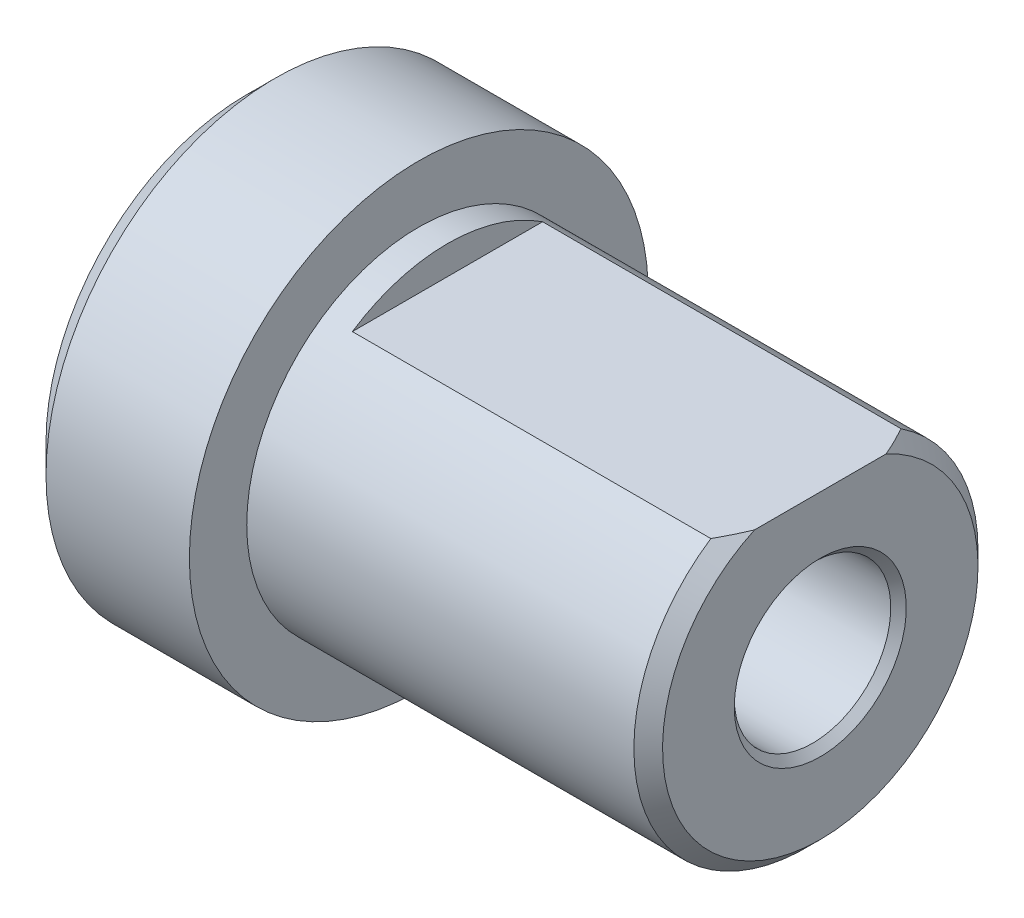
ISO-10303-21;
HEADER;
FILE_DESCRIPTION(('STEP AP214'),'2;1');
FILE_NAME('part.step','',(''),(''),'','','');
FILE_SCHEMA(('AUTOMOTIVE_DESIGN { 1 0 10303 214 1 1 1 1 }'));
ENDSEC;
DATA;
#1=APPLICATION_CONTEXT('core data for automotive mechanical design processes');
#2=APPLICATION_PROTOCOL_DEFINITION('international standard','automotive_design',2000,#1);
#3=PRODUCT_CONTEXT('',#1,'mechanical');
#4=PRODUCT('Part','Part','',(#3));
#5=PRODUCT_RELATED_PRODUCT_CATEGORY('part','',(#4));
#6=PRODUCT_DEFINITION_FORMATION('','',#4);
#7=PRODUCT_DEFINITION_CONTEXT('part definition',#1,'design');
#8=PRODUCT_DEFINITION('design','',#6,#7);
#9=PRODUCT_DEFINITION_SHAPE('','',#8);
#10=(LENGTH_UNIT() NAMED_UNIT(*) SI_UNIT(.MILLI.,.METRE.));
#11=(NAMED_UNIT(*) PLANE_ANGLE_UNIT() SI_UNIT($,.RADIAN.));
#12=(NAMED_UNIT(*) SI_UNIT($,.STERADIAN.) SOLID_ANGLE_UNIT());
#13=UNCERTAINTY_MEASURE_WITH_UNIT(LENGTH_MEASURE(1.E-05),#10,'distance_accuracy_value','');
#14=(GEOMETRIC_REPRESENTATION_CONTEXT(3) GLOBAL_UNCERTAINTY_ASSIGNED_CONTEXT((#13)) GLOBAL_UNIT_ASSIGNED_CONTEXT((#10,
#11,#12)) REPRESENTATION_CONTEXT('',''));
#15=CARTESIAN_POINT('',(0.,0.,0.));
#16=DIRECTION('',(0.,0.,1.));
#17=DIRECTION('',(1.,0.,0.));
#18=AXIS2_PLACEMENT_3D('',#15,#16,#17);
#19=CARTESIAN_POINT('',(0.,1.5,0.));
#20=DIRECTION('',(-1.,0.,0.));
#21=DIRECTION('',(0.,0.,1.));
#22=AXIS2_PLACEMENT_3D('',#19,#20,#21);
#23=PLANE('',#22);
#24=CARTESIAN_POINT('',(0.,0.,0.));
#25=DIRECTION('',(-1.,0.,0.));
#26=DIRECTION('',(0.,0.,1.));
#27=AXIS2_PLACEMENT_3D('',#24,#25,#26);
#28=CIRCLE('',#27,1.5);
#29=CARTESIAN_POINT('',(0.,0.,1.5));
#30=VERTEX_POINT('',#29);
#31=EDGE_CURVE('E101',#30,#30,#28,.T.);
#32=ORIENTED_EDGE('',*,*,#31,.T.);
#33=EDGE_LOOP('',(#32));
#34=FACE_BOUND('',#33,.T.);
#35=CARTESIAN_POINT('',(0.,0.,0.));
#36=DIRECTION('',(-1.,0.,0.));
#37=DIRECTION('',(0.,0.,1.));
#38=AXIS2_PLACEMENT_3D('',#35,#36,#37);
#39=CIRCLE('',#38,2.75);
#40=CARTESIAN_POINT('',(0.,2.5,-1.14564392373896));
#41=VERTEX_POINT('',#40);
#42=CARTESIAN_POINT('',(0.,2.5,1.14564392373896));
#43=VERTEX_POINT('',#42);
#44=EDGE_CURVE('E76',#41,#43,#39,.T.);
#45=ORIENTED_EDGE('',*,*,#44,.F.);
#46=DIRECTION('',(0.,0.,-1.));
#47=VECTOR('',#46,1.);
#48=CARTESIAN_POINT('',(0.,2.5,4.));
#49=LINE('',#48,#47);
#50=EDGE_CURVE('E83',#43,#41,#49,.T.);
#51=ORIENTED_EDGE('',*,*,#50,.F.);
#52=EDGE_LOOP('',(#45,#51));
#53=FACE_BOUND('',#52,.T.);
#54=ADVANCED_FACE('F37',(#34,#53),#23,.F.);
#55=CARTESIAN_POINT('',(0.,0.,0.));
#56=DIRECTION('',(-1.,0.,0.));
#57=DIRECTION('',(0.,0.,1.));
#58=AXIS2_PLACEMENT_3D('',#55,#56,#57);
#59=CYLINDRICAL_SURFACE('',#58,3.);
#60=CARTESIAN_POINT('',(-7.,0.,0.));
#61=DIRECTION('',(-1.,0.,0.));
#62=DIRECTION('',(0.,0.,1.));
#63=AXIS2_PLACEMENT_3D('',#60,#61,#62);
#64=CIRCLE('',#63,3.);
#65=CARTESIAN_POINT('',(-7.,0.,3.));
#66=VERTEX_POINT('',#65);
#67=EDGE_CURVE('E98',#66,#66,#64,.T.);
#68=ORIENTED_EDGE('',*,*,#67,.F.);
#69=EDGE_LOOP('',(#68));
#70=FACE_BOUND('',#69,.T.);
#71=CARTESIAN_POINT('',(-0.25,0.,0.));
#72=DIRECTION('',(-1.,0.,0.));
#73=DIRECTION('',(0.,0.,1.));
#74=AXIS2_PLACEMENT_3D('',#71,#72,#73);
#75=CIRCLE('',#74,3.);
#76=CARTESIAN_POINT('',(-0.25,2.5,-1.6583123951777));
#77=VERTEX_POINT('',#76);
#78=CARTESIAN_POINT('',(-0.25,2.5,1.6583123951777));
#79=VERTEX_POINT('',#78);
#80=EDGE_CURVE('E57',#77,#79,#75,.T.);
#81=ORIENTED_EDGE('',*,*,#80,.T.);
#82=DIRECTION('',(-1.,0.,0.));
#83=VECTOR('',#82,1.);
#84=CARTESIAN_POINT('',(0.,2.5,1.6583123951777));
#85=LINE('',#84,#83);
#86=CARTESIAN_POINT('',(-6.5,2.5,1.6583123951777));
#87=VERTEX_POINT('',#86);
#88=EDGE_CURVE('E85',#87,#79,#85,.F.);
#89=ORIENTED_EDGE('',*,*,#88,.F.);
#90=CARTESIAN_POINT('',(-6.5,0.,0.));
#91=DIRECTION('',(1.,0.,0.));
#92=DIRECTION('',(0.,0.,-1.));
#93=AXIS2_PLACEMENT_3D('',#90,#91,#92);
#94=CIRCLE('',#93,3.);
#95=CARTESIAN_POINT('',(-6.5,2.5,-1.6583123951777));
#96=VERTEX_POINT('',#95);
#97=EDGE_CURVE('E114',#96,#87,#94,.T.);
#98=ORIENTED_EDGE('',*,*,#97,.F.);
#99=DIRECTION('',(-1.,0.,0.));
#100=VECTOR('',#99,1.);
#101=CARTESIAN_POINT('',(0.,2.5,-1.6583123951777));
#102=LINE('',#101,#100);
#103=EDGE_CURVE('E115',#77,#96,#102,.T.);
#104=ORIENTED_EDGE('',*,*,#103,.F.);
#105=EDGE_LOOP('',(#81,#89,#98,#104));
#106=FACE_BOUND('',#105,.T.);
#107=ADVANCED_FACE('F119',(#70,#106),#59,.T.);
#108=CARTESIAN_POINT('',(0.,2.5,0.));
#109=DIRECTION('',(0.,1.,0.));
#110=DIRECTION('',(0.,0.,1.));
#111=AXIS2_PLACEMENT_3D('',#108,#109,#110);
#112=PLANE('',#111);
#113=ORIENTED_EDGE('',*,*,#88,.T.);
#114=CARTESIAN_POINT('',(-1.67749195989252,2.5,3.65413259952521));
#115=CARTESIAN_POINT('',(-1.62395797741389,2.5,3.58926544106276));
#116=CARTESIAN_POINT('',(-1.57069094200197,2.5,3.524178215062));
#117=CARTESIAN_POINT('',(-1.46477799794177,2.5,3.39349697429184));
#118=CARTESIAN_POINT('',(-1.41213211006432,2.5,3.32790294269585));
#119=CARTESIAN_POINT('',(-1.25513407873059,2.5,3.13010554410299));
#120=CARTESIAN_POINT('',(-1.15185334275176,2.5,2.99704569542344));
#121=CARTESIAN_POINT('',(-0.946885856877835,2.5,2.72491566850451));
#122=CARTESIAN_POINT('',(-0.845288829592145,2.5,2.58577762209185));
#123=CARTESIAN_POINT('',(-0.647912105180442,2.5,2.30348196113854));
#124=CARTESIAN_POINT('',(-0.552129513625497,2.5,2.16032639928944));
#125=CARTESIAN_POINT('',(-0.401757387795607,2.5,1.92064577038633));
#126=CARTESIAN_POINT('',(-0.344660397222246,2.5,1.82570039234345));
#127=CARTESIAN_POINT('',(-0.235123218787926,2.5,1.63316774847458));
#128=CARTESIAN_POINT('',(-0.18268176642285,2.5,1.53558120947657));
#129=CARTESIAN_POINT('',(-0.0841516374493152,2.5,1.33780837117945));
#130=CARTESIAN_POINT('',(-0.0380334796287256,2.5,1.23763691785783));
#131=CARTESIAN_POINT('',(0.0462014787861243,2.5,1.03397456861831));
#132=CARTESIAN_POINT('',(0.0843227670678341,2.5,0.93048557223631));
#133=CARTESIAN_POINT('',(0.140017114636043,2.5,0.752829484772054));
#134=CARTESIAN_POINT('',(0.160297058056315,2.5,0.679513500497337));
#135=CARTESIAN_POINT('',(0.195127462600921,2.5,0.531542595451983));
#136=CARTESIAN_POINT('',(0.209680225768848,2.5,0.456888225288227));
#137=CARTESIAN_POINT('',(0.232333990979544,2.5,0.306800353992969));
#138=CARTESIAN_POINT('',(0.240452398034348,2.5,0.231369517706711));
#139=CARTESIAN_POINT('',(0.249856995627712,2.5,0.0800786665543288));
#140=CARTESIAN_POINT('',(0.251143441921742,2.5,0.00421866786039122));
#141=CARTESIAN_POINT('',(0.246807578747195,2.5,-0.147375922436032));
#142=CARTESIAN_POINT('',(0.241178399810755,2.5,-0.223110314395744));
#143=CARTESIAN_POINT('',(0.223318628808779,2.5,-0.373790159303397));
#144=CARTESIAN_POINT('',(0.211087461897093,2.5,-0.448735542971649));
#145=CARTESIAN_POINT('',(0.180595804372142,2.5,-0.597639128662982));
#146=CARTESIAN_POINT('',(0.162314987243843,2.5,-0.671593115900845));
#147=CARTESIAN_POINT('',(0.120517881314084,2.5,-0.817981614725862));
#148=CARTESIAN_POINT('',(0.0970015494285237,2.5,-0.890416113803476));
#149=CARTESIAN_POINT('',(0.0105937929552411,2.5,-1.13106070421559));
#150=CARTESIAN_POINT('',(-0.062381323139259,2.5,-1.29567172889325));
#151=CARTESIAN_POINT('',(-0.183607500129111,2.5,-1.53650568367434));
#152=CARTESIAN_POINT('',(-0.226036792499501,2.5,-1.61586458426326));
#153=CARTESIAN_POINT('',(-0.314082796919921,2.5,-1.77279955607548));
#154=CARTESIAN_POINT('',(-0.359699051429776,2.5,-1.8503758811));
#155=CARTESIAN_POINT('',(-0.50095236624636,2.5,-2.08176845700008));
#156=CARTESIAN_POINT('',(-0.600452506830223,2.5,-2.2332131319978));
#157=CARTESIAN_POINT('',(-0.806078378820841,2.5,-2.53125630459559));
#158=CARTESIAN_POINT('',(-0.912198114424832,2.5,-2.67785900893076));
#159=CARTESIAN_POINT('',(-1.12708837042466,2.5,-2.96491018555446));
#160=CARTESIAN_POINT('',(-1.23577435936566,2.5,-3.10542224200297));
#161=CARTESIAN_POINT('',(-1.4005887507484,2.5,-3.31347804417295));
#162=CARTESIAN_POINT('',(-1.4555032678476,2.5,-3.38199111675543));
#163=CARTESIAN_POINT('',(-1.56601230637735,2.5,-3.51846014985454));
#164=CARTESIAN_POINT('',(-1.62160678709349,2.5,-3.58641614332456));
#165=CARTESIAN_POINT('',(-1.67749195989252,2.5,-3.65413259952521));
#166=B_SPLINE_CURVE_WITH_KNOTS('',3,(#114,#115,#116,#117,#118,#119,#120,#121,#122,#123,#124,
#125,#126,#127,#128,#129,#130,#131,#132,#133,#134,#135,#136,#137,#138,#139,#140,#141,#142,#143,
#144,#145,#146,#147,#148,#149,#150,#151,#152,#153,#154,#155,#156,#157,#158,#159,#160,#161,#162,
#163,#164,#165),.UNSPECIFIED.,.F.,.F.,(4,2,2,2,2,2,2,2,2,2,2,2,2,2,2,2,2,2,2,2,2,2,2,2,2,4),(0.,
0.25231307319132,0.504634559814167,1.00989653913261,1.52665364516633,2.04315136335998,
2.37542919710035,2.70761650199845,3.03819816560234,3.36859381397354,3.59660850520671,
3.82453145195833,4.05183573983055,4.27913151847287,4.50665325850679,4.73419481243615,
4.96250879102862,5.19082464853207,5.72937702800235,5.99932397808088,6.26923225221504,
6.81254493708658,7.35537245939352,7.88822611015625,8.15163686516664,8.41503192431477),.UNSPECIFIED.);
#167=EDGE_CURVE('E11',#79,#43,#166,.T.);
#168=ORIENTED_EDGE('',*,*,#167,.T.);
#169=ORIENTED_EDGE('',*,*,#50,.T.);
#170=EDGE_CURVE('E41',#41,#77,#166,.T.);
#171=ORIENTED_EDGE('',*,*,#170,.T.);
#172=ORIENTED_EDGE('',*,*,#103,.T.);
#173=DIRECTION('',(0.,0.,1.));
#174=VECTOR('',#173,1.);
#175=CARTESIAN_POINT('',(-6.5,2.5,-4.));
#176=LINE('',#175,#174);
#177=EDGE_CURVE('E65',#96,#87,#176,.T.);
#178=ORIENTED_EDGE('',*,*,#177,.T.);
#179=EDGE_LOOP('',(#113,#168,#169,#171,#172,#178));
#180=FACE_BOUND('',#179,.T.);
#181=ADVANCED_FACE('F82',(#180),#112,.T.);
#182=CARTESIAN_POINT('',(-10.,3.5,0.));
#183=DIRECTION('',(1.,0.,0.));
#184=DIRECTION('',(0.,0.,-1.));
#185=AXIS2_PLACEMENT_3D('',#182,#183,#184);
#186=PLANE('',#185);
#187=CARTESIAN_POINT('',(-10.,0.,0.));
#188=DIRECTION('',(-1.,0.,0.));
#189=DIRECTION('',(0.,0.,1.));
#190=AXIS2_PLACEMENT_3D('',#187,#188,#189);
#191=CIRCLE('',#190,1.5);
#192=CARTESIAN_POINT('',(-10.,0.,1.5));
#193=VERTEX_POINT('',#192);
#194=EDGE_CURVE('E110',#193,#193,#191,.T.);
#195=ORIENTED_EDGE('',*,*,#194,.F.);
#196=EDGE_LOOP('',(#195));
#197=FACE_BOUND('',#196,.T.);
#198=CARTESIAN_POINT('',(-10.,0.,0.));
#199=DIRECTION('',(-1.,0.,0.));
#200=DIRECTION('',(0.,0.,1.));
#201=AXIS2_PLACEMENT_3D('',#198,#199,#200);
#202=CIRCLE('',#201,3.5);
#203=CARTESIAN_POINT('',(-10.,0.,3.5));
#204=VERTEX_POINT('',#203);
#205=EDGE_CURVE('E86',#204,#204,#202,.T.);
#206=ORIENTED_EDGE('',*,*,#205,.T.);
#207=EDGE_LOOP('',(#206));
#208=FACE_BOUND('',#207,.T.);
#209=ADVANCED_FACE('F39',(#197,#208),#186,.F.);
#210=CARTESIAN_POINT('',(-10.,0.,0.));
#211=DIRECTION('',(-1.,0.,0.));
#212=DIRECTION('',(0.,0.,1.));
#213=AXIS2_PLACEMENT_3D('',#210,#211,#212);
#214=CONICAL_SURFACE('',#213,1.5,0.785398163397447);
#215=CARTESIAN_POINT('',(-9.8645,0.,0.));
#216=DIRECTION('',(-1.,0.,0.));
#217=DIRECTION('',(0.,0.,1.));
#218=AXIS2_PLACEMENT_3D('',#215,#216,#217);
#219=CIRCLE('',#218,1.3645);
#220=CARTESIAN_POINT('',(-9.8645,0.,1.3645));
#221=VERTEX_POINT('',#220);
#222=EDGE_CURVE('E107',#221,#221,#219,.T.);
#223=ORIENTED_EDGE('',*,*,#222,.F.);
#224=EDGE_LOOP('',(#223));
#225=FACE_BOUND('',#224,.T.);
#226=ORIENTED_EDGE('',*,*,#194,.T.);
#227=EDGE_LOOP('',(#226));
#228=FACE_BOUND('',#227,.T.);
#229=ADVANCED_FACE('F149',(#225,#228),#214,.F.);
#230=CARTESIAN_POINT('',(0.,0.,0.));
#231=DIRECTION('',(-1.,0.,0.));
#232=DIRECTION('',(0.,0.,1.));
#233=AXIS2_PLACEMENT_3D('',#230,#231,#232);
#234=CYLINDRICAL_SURFACE('',#233,1.3645);
#235=CARTESIAN_POINT('',(-0.1355,0.,0.));
#236=DIRECTION('',(-1.,0.,0.));
#237=DIRECTION('',(0.,0.,1.));
#238=AXIS2_PLACEMENT_3D('',#235,#236,#237);
#239=CIRCLE('',#238,1.3645);
#240=CARTESIAN_POINT('',(-0.1355,0.,1.3645));
#241=VERTEX_POINT('',#240);
#242=EDGE_CURVE('E104',#241,#241,#239,.T.);
#243=ORIENTED_EDGE('',*,*,#242,.F.);
#244=EDGE_LOOP('',(#243));
#245=FACE_BOUND('',#244,.T.);
#246=ORIENTED_EDGE('',*,*,#222,.T.);
#247=EDGE_LOOP('',(#246));
#248=FACE_BOUND('',#247,.T.);
#249=ADVANCED_FACE('F146',(#245,#248),#234,.F.);
#250=CARTESIAN_POINT('',(-0.1355,0.,0.));
#251=DIRECTION('',(1.,0.,0.));
#252=DIRECTION('',(0.,0.,-1.));
#253=AXIS2_PLACEMENT_3D('',#250,#251,#252);
#254=CONICAL_SURFACE('',#253,1.3645,0.785398163397447);
#255=ORIENTED_EDGE('',*,*,#31,.F.);
#256=EDGE_LOOP('',(#255));
#257=FACE_BOUND('',#256,.T.);
#258=ORIENTED_EDGE('',*,*,#242,.T.);
#259=EDGE_LOOP('',(#258));
#260=FACE_BOUND('',#259,.T.);
#261=ADVANCED_FACE('F142',(#257,#260),#254,.F.);
#262=CARTESIAN_POINT('',(-7.,3.,0.));
#263=DIRECTION('',(-1.,0.,0.));
#264=DIRECTION('',(0.,0.,1.));
#265=AXIS2_PLACEMENT_3D('',#262,#263,#264);
#266=PLANE('',#265);
#267=CARTESIAN_POINT('',(-7.,0.,0.));
#268=DIRECTION('',(-1.,0.,0.));
#269=DIRECTION('',(0.,0.,1.));
#270=AXIS2_PLACEMENT_3D('',#267,#268,#269);
#271=CIRCLE('',#270,4.);
#272=CARTESIAN_POINT('',(-7.,0.,4.));
#273=VERTEX_POINT('',#272);
#274=EDGE_CURVE('E95',#273,#273,#271,.T.);
#275=ORIENTED_EDGE('',*,*,#274,.F.);
#276=EDGE_LOOP('',(#275));
#277=FACE_BOUND('',#276,.T.);
#278=ORIENTED_EDGE('',*,*,#67,.T.);
#279=EDGE_LOOP('',(#278));
#280=FACE_BOUND('',#279,.T.);
#281=ADVANCED_FACE('F145',(#277,#280),#266,.F.);
#282=CARTESIAN_POINT('',(0.,0.,0.));
#283=DIRECTION('',(-1.,0.,0.));
#284=DIRECTION('',(0.,0.,1.));
#285=AXIS2_PLACEMENT_3D('',#282,#283,#284);
#286=CYLINDRICAL_SURFACE('',#285,4.);
#287=CARTESIAN_POINT('',(-9.5,0.,0.));
#288=DIRECTION('',(-1.,0.,0.));
#289=DIRECTION('',(0.,0.,1.));
#290=AXIS2_PLACEMENT_3D('',#287,#288,#289);
#291=CIRCLE('',#290,4.);
#292=CARTESIAN_POINT('',(-9.5,0.,4.));
#293=VERTEX_POINT('',#292);
#294=EDGE_CURVE('E89',#293,#293,#291,.T.);
#295=ORIENTED_EDGE('',*,*,#294,.F.);
#296=EDGE_LOOP('',(#295));
#297=FACE_BOUND('',#296,.T.);
#298=ORIENTED_EDGE('',*,*,#274,.T.);
#299=EDGE_LOOP('',(#298));
#300=FACE_BOUND('',#299,.T.);
#301=ADVANCED_FACE('F129',(#297,#300),#286,.T.);
#302=CARTESIAN_POINT('',(-9.5,0.,0.));
#303=DIRECTION('',(1.,0.,0.));
#304=DIRECTION('',(0.,0.,-1.));
#305=AXIS2_PLACEMENT_3D('',#302,#303,#304);
#306=CONICAL_SURFACE('',#305,4.,0.785398163397448);
#307=ORIENTED_EDGE('',*,*,#205,.F.);
#308=EDGE_LOOP('',(#307));
#309=FACE_BOUND('',#308,.T.);
#310=ORIENTED_EDGE('',*,*,#294,.T.);
#311=EDGE_LOOP('',(#310));
#312=FACE_BOUND('',#311,.T.);
#313=ADVANCED_FACE('F123',(#309,#312),#306,.T.);
#314=CARTESIAN_POINT('',(-6.5,5.5,-4.));
#315=DIRECTION('',(1.,0.,0.));
#316=DIRECTION('',(0.,0.,-1.));
#317=AXIS2_PLACEMENT_3D('',#314,#315,#316);
#318=PLANE('',#317);
#319=ORIENTED_EDGE('',*,*,#97,.T.);
#320=ORIENTED_EDGE('',*,*,#177,.F.);
#321=EDGE_LOOP('',(#319,#320));
#322=FACE_BOUND('',#321,.T.);
#323=ADVANCED_FACE('F121',(#322),#318,.T.);
#324=CARTESIAN_POINT('',(-0.25,0.,0.));
#325=DIRECTION('',(-1.,0.,0.));
#326=DIRECTION('',(0.,0.,1.));
#327=AXIS2_PLACEMENT_3D('',#324,#325,#326);
#328=CONICAL_SURFACE('',#327,3.,0.785398163397449);
#329=ORIENTED_EDGE('',*,*,#80,.F.);
#330=ORIENTED_EDGE('',*,*,#170,.F.);
#331=ORIENTED_EDGE('',*,*,#44,.T.);
#332=ORIENTED_EDGE('',*,*,#167,.F.);
#333=EDGE_LOOP('',(#329,#330,#331,#332));
#334=FACE_BOUND('',#333,.T.);
#335=ADVANCED_FACE('F77',(#334),#328,.T.);
#336=CLOSED_SHELL('',(#54,#107,#181,#209,#229,#249,#261,#281,#301,#313,#323,#335));
#337=MANIFOLD_SOLID_BREP('B2',#336);
#338=ADVANCED_BREP_SHAPE_REPRESENTATION('',(#18,#337),#14);
#339=SHAPE_DEFINITION_REPRESENTATION(#9,#338);
ENDSEC;
END-ISO-10303-21;
